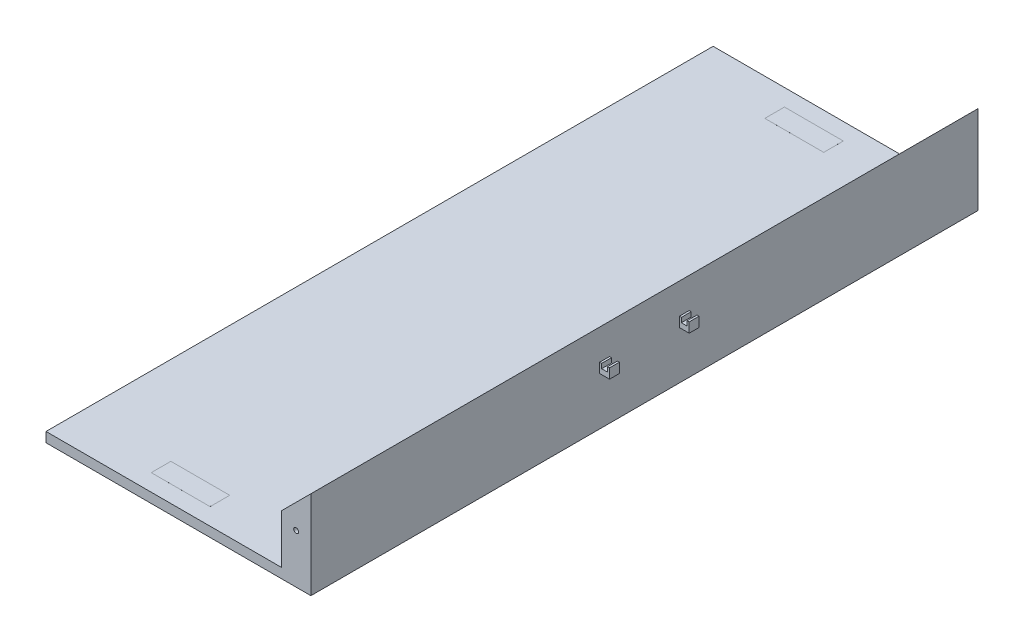
ISO-10303-21;
HEADER;
FILE_DESCRIPTION(('STEP AP214'),'2;1');
FILE_NAME('part.step','',(''),(''),'','','');
FILE_SCHEMA(('AUTOMOTIVE_DESIGN { 1 0 10303 214 1 1 1 1 }'));
ENDSEC;
DATA;
#1=APPLICATION_CONTEXT('core data for automotive mechanical design processes');
#2=APPLICATION_PROTOCOL_DEFINITION('international standard','automotive_design',2000,#1);
#3=PRODUCT_CONTEXT('',#1,'mechanical');
#4=PRODUCT('Part','Part','',(#3));
#5=PRODUCT_RELATED_PRODUCT_CATEGORY('part','',(#4));
#6=PRODUCT_DEFINITION_FORMATION('','',#4);
#7=PRODUCT_DEFINITION_CONTEXT('part definition',#1,'design');
#8=PRODUCT_DEFINITION('design','',#6,#7);
#9=PRODUCT_DEFINITION_SHAPE('','',#8);
#10=(LENGTH_UNIT() NAMED_UNIT(*) SI_UNIT(.MILLI.,.METRE.));
#11=(NAMED_UNIT(*) PLANE_ANGLE_UNIT() SI_UNIT($,.RADIAN.));
#12=(NAMED_UNIT(*) SI_UNIT($,.STERADIAN.) SOLID_ANGLE_UNIT());
#13=UNCERTAINTY_MEASURE_WITH_UNIT(LENGTH_MEASURE(1.E-05),#10,'distance_accuracy_value','');
#14=(GEOMETRIC_REPRESENTATION_CONTEXT(3) GLOBAL_UNCERTAINTY_ASSIGNED_CONTEXT((#13)) GLOBAL_UNIT_ASSIGNED_CONTEXT((#10,
#11,#12)) REPRESENTATION_CONTEXT('',''));
#15=CARTESIAN_POINT('',(0.,0.,0.));
#16=DIRECTION('',(0.,0.,1.));
#17=DIRECTION('',(1.,0.,0.));
#18=AXIS2_PLACEMENT_3D('',#15,#16,#17);
#19=CARTESIAN_POINT('',(50.8,74.8342633823014,489.713888914943));
#20=DIRECTION('',(0.,-1.,0.));
#21=DIRECTION('',(0.,0.,-1.));
#22=AXIS2_PLACEMENT_3D('',#19,#20,#21);
#23=PLANE('',#22);
#24=DIRECTION('',(-1.,0.,0.));
#25=VECTOR('',#24,1.);
#26=CARTESIAN_POINT('',(50.8,74.8342633823014,489.713888914943));
#27=LINE('',#26,#25);
#28=CARTESIAN_POINT('',(40.6685272217805,74.8342633823014,489.713888914943));
#29=VERTEX_POINT('',#28);
#30=CARTESIAN_POINT('',(38.1,74.8342633823014,489.713888914943));
#31=VERTEX_POINT('',#30);
#32=EDGE_CURVE('E382',#29,#31,#27,.T.);
#33=ORIENTED_EDGE('',*,*,#32,.F.);
#34=DIRECTION('',(0.,0.,1.));
#35=VECTOR('',#34,1.);
#36=CARTESIAN_POINT('',(40.6685272217805,74.8342633823014,352.045888914943));
#37=LINE('',#36,#35);
#38=CARTESIAN_POINT('',(40.6685272217805,74.8342633823014,477.013888914943));
#39=VERTEX_POINT('',#38);
#40=EDGE_CURVE('E270',#39,#29,#37,.T.);
#41=ORIENTED_EDGE('',*,*,#40,.F.);
#42=DIRECTION('',(-1.,0.,0.));
#43=VECTOR('',#42,1.);
#44=CARTESIAN_POINT('',(50.8,74.8342633823014,477.013888914943));
#45=LINE('',#44,#43);
#46=CARTESIAN_POINT('',(38.1,74.8342633823014,477.013888914943));
#47=VERTEX_POINT('',#46);
#48=EDGE_CURVE('E385',#39,#47,#45,.T.);
#49=ORIENTED_EDGE('',*,*,#48,.T.);
#50=DIRECTION('',(0.,0.,1.));
#51=VECTOR('',#50,1.);
#52=CARTESIAN_POINT('',(38.1,74.8342633823014,489.713888914943));
#53=LINE('',#52,#51);
#54=EDGE_CURVE('E364',#47,#31,#53,.T.);
#55=ORIENTED_EDGE('',*,*,#54,.T.);
#56=EDGE_LOOP('',(#33,#41,#49,#55));
#57=FACE_BOUND('',#56,.T.);
#58=ADVANCED_FACE('F39',(#57),#23,.F.);
#59=CARTESIAN_POINT('',(50.8,74.8342633823014,373.886111085057));
#60=DIRECTION('',(0.,-1.,0.));
#61=DIRECTION('',(0.,0.,-1.));
#62=AXIS2_PLACEMENT_3D('',#59,#60,#61);
#63=PLANE('',#62);
#64=DIRECTION('',(-1.,0.,0.));
#65=VECTOR('',#64,1.);
#66=CARTESIAN_POINT('',(50.8,74.8342633823014,386.586111085057));
#67=LINE('',#66,#65);
#68=CARTESIAN_POINT('',(40.6685272217805,74.8342633823014,386.586111085057));
#69=VERTEX_POINT('',#68);
#70=CARTESIAN_POINT('',(38.1,74.8342633823014,386.586111085057));
#71=VERTEX_POINT('',#70);
#72=EDGE_CURVE('E335',#69,#71,#67,.T.);
#73=ORIENTED_EDGE('',*,*,#72,.F.);
#74=CARTESIAN_POINT('',(40.6685272217805,74.8342633823014,373.886111085057));
#75=VERTEX_POINT('',#74);
#76=EDGE_CURVE('E269',#75,#69,#37,.T.);
#77=ORIENTED_EDGE('',*,*,#76,.F.);
#78=DIRECTION('',(-1.,0.,0.));
#79=VECTOR('',#78,1.);
#80=CARTESIAN_POINT('',(50.8,74.8342633823014,373.886111085057));
#81=LINE('',#80,#79);
#82=CARTESIAN_POINT('',(38.1,74.8342633823014,373.886111085057));
#83=VERTEX_POINT('',#82);
#84=EDGE_CURVE('E340',#75,#83,#81,.T.);
#85=ORIENTED_EDGE('',*,*,#84,.T.);
#86=DIRECTION('',(0.,0.,1.));
#87=VECTOR('',#86,1.);
#88=CARTESIAN_POINT('',(38.1,74.8342633823014,373.886111085057));
#89=LINE('',#88,#87);
#90=EDGE_CURVE('E317',#83,#71,#89,.T.);
#91=ORIENTED_EDGE('',*,*,#90,.T.);
#92=EDGE_LOOP('',(#73,#77,#85,#91));
#93=FACE_BOUND('',#92,.T.);
#94=ADVANCED_FACE('F603',(#93),#63,.F.);
#95=CARTESIAN_POINT('',(38.1,0.,863.6));
#96=DIRECTION('',(-1.,0.,0.));
#97=DIRECTION('',(0.,0.,1.));
#98=AXIS2_PLACEMENT_3D('',#95,#96,#97);
#99=PLANE('',#98);
#100=DIRECTION('',(0.,1.,0.));
#101=VECTOR('',#100,1.);
#102=CARTESIAN_POINT('',(38.1,74.8342633823014,477.013888914943));
#103=LINE('',#102,#101);
#104=CARTESIAN_POINT('',(38.1,62.1342633823014,477.013888914943));
#105=VERTEX_POINT('',#104);
#106=EDGE_CURVE('E345',#105,#47,#103,.T.);
#107=ORIENTED_EDGE('',*,*,#106,.F.);
#108=DIRECTION('',(0.,0.,-1.));
#109=VECTOR('',#108,1.);
#110=CARTESIAN_POINT('',(38.1,62.1342633823014,489.713888914943));
#111=LINE('',#110,#109);
#112=CARTESIAN_POINT('',(38.1,62.1342633823014,489.713888914943));
#113=VERTEX_POINT('',#112);
#114=EDGE_CURVE('E351',#113,#105,#111,.T.);
#115=ORIENTED_EDGE('',*,*,#114,.F.);
#116=DIRECTION('',(0.,-1.,0.));
#117=VECTOR('',#116,1.);
#118=CARTESIAN_POINT('',(38.1,74.8342633823014,489.713888914943));
#119=LINE('',#118,#117);
#120=EDGE_CURVE('E368',#31,#113,#119,.T.);
#121=ORIENTED_EDGE('',*,*,#120,.F.);
#122=ORIENTED_EDGE('',*,*,#54,.F.);
#123=EDGE_LOOP('',(#107,#115,#121,#122));
#124=FACE_BOUND('',#123,.T.);
#125=DIRECTION('',(0.,1.,0.));
#126=VECTOR('',#125,1.);
#127=CARTESIAN_POINT('',(38.1,0.,0.));
#128=LINE('',#127,#126);
#129=CARTESIAN_POINT('',(38.1,0.,0.));
#130=VERTEX_POINT('',#129);
#131=CARTESIAN_POINT('',(38.1,114.3,0.));
#132=VERTEX_POINT('',#131);
#133=EDGE_CURVE('E528',#130,#132,#128,.T.);
#134=ORIENTED_EDGE('',*,*,#133,.T.);
#135=DIRECTION('',(0.,0.,-1.));
#136=VECTOR('',#135,1.);
#137=CARTESIAN_POINT('',(38.1,114.3,863.6));
#138=LINE('',#137,#136);
#139=CARTESIAN_POINT('',(38.1,114.3,863.6));
#140=VERTEX_POINT('',#139);
#141=EDGE_CURVE('E537',#140,#132,#138,.T.);
#142=ORIENTED_EDGE('',*,*,#141,.F.);
#143=DIRECTION('',(0.,1.,0.));
#144=VECTOR('',#143,1.);
#145=CARTESIAN_POINT('',(38.1,0.,863.6));
#146=LINE('',#145,#144);
#147=CARTESIAN_POINT('',(38.1,0.,863.6));
#148=VERTEX_POINT('',#147);
#149=EDGE_CURVE('E516',#148,#140,#146,.T.);
#150=ORIENTED_EDGE('',*,*,#149,.F.);
#151=DIRECTION('',(0.,0.,-1.));
#152=VECTOR('',#151,1.);
#153=CARTESIAN_POINT('',(38.1,0.,863.6));
#154=LINE('',#153,#152);
#155=EDGE_CURVE('E541',#148,#130,#154,.T.);
#156=ORIENTED_EDGE('',*,*,#155,.T.);
#157=EDGE_LOOP('',(#134,#142,#150,#156));
#158=FACE_BOUND('',#157,.T.);
#159=DIRECTION('',(0.,1.,0.));
#160=VECTOR('',#159,1.);
#161=CARTESIAN_POINT('',(38.1,74.8342633823014,373.886111085057));
#162=LINE('',#161,#160);
#163=CARTESIAN_POINT('',(38.1,62.1342633823014,373.886111085057));
#164=VERTEX_POINT('',#163);
#165=EDGE_CURVE('E298',#164,#83,#162,.T.);
#166=ORIENTED_EDGE('',*,*,#165,.F.);
#167=DIRECTION('',(0.,0.,-1.));
#168=VECTOR('',#167,1.);
#169=CARTESIAN_POINT('',(38.1,62.1342633823014,373.886111085057));
#170=LINE('',#169,#168);
#171=CARTESIAN_POINT('',(38.1,62.1342633823014,386.586111085057));
#172=VERTEX_POINT('',#171);
#173=EDGE_CURVE('E304',#172,#164,#170,.T.);
#174=ORIENTED_EDGE('',*,*,#173,.F.);
#175=DIRECTION('',(0.,-1.,0.));
#176=VECTOR('',#175,1.);
#177=CARTESIAN_POINT('',(38.1,74.8342633823014,386.586111085057));
#178=LINE('',#177,#176);
#179=EDGE_CURVE('E321',#71,#172,#178,.T.);
#180=ORIENTED_EDGE('',*,*,#179,.F.);
#181=ORIENTED_EDGE('',*,*,#90,.F.);
#182=EDGE_LOOP('',(#166,#174,#180,#181));
#183=FACE_BOUND('',#182,.T.);
#184=ADVANCED_FACE('F578',(#124,#158,#183),#99,.F.);
#185=CARTESIAN_POINT('',(0.,12.7,863.6));
#186=DIRECTION('',(0.,1.,0.));
#187=DIRECTION('',(-1.,0.,0.));
#188=AXIS2_PLACEMENT_3D('',#185,#186,#187);
#189=PLANE('',#188);
#190=DIRECTION('',(1.,0.,0.));
#191=VECTOR('',#190,1.);
#192=CARTESIAN_POINT('',(0.,12.7,0.));
#193=LINE('',#192,#191);
#194=CARTESIAN_POINT('',(-304.8,12.7,0.));
#195=VERTEX_POINT('',#194);
#196=CARTESIAN_POINT('',(0.,12.7,0.));
#197=VERTEX_POINT('',#196);
#198=EDGE_CURVE('E478',#195,#197,#193,.T.);
#199=ORIENTED_EDGE('',*,*,#198,.F.);
#200=DIRECTION('',(0.,0.,-1.));
#201=VECTOR('',#200,1.);
#202=CARTESIAN_POINT('',(-304.8,12.7,863.6));
#203=LINE('',#202,#201);
#204=CARTESIAN_POINT('',(-304.8,12.7,863.6));
#205=VERTEX_POINT('',#204);
#206=EDGE_CURVE('E494',#205,#195,#203,.T.);
#207=ORIENTED_EDGE('',*,*,#206,.F.);
#208=DIRECTION('',(1.,0.,0.));
#209=VECTOR('',#208,1.);
#210=CARTESIAN_POINT('',(0.,12.7,863.6));
#211=LINE('',#210,#209);
#212=CARTESIAN_POINT('',(0.,12.7,863.6));
#213=VERTEX_POINT('',#212);
#214=EDGE_CURVE('E477',#205,#213,#211,.T.);
#215=ORIENTED_EDGE('',*,*,#214,.T.);
#216=DIRECTION('',(0.,0.,-1.));
#217=VECTOR('',#216,1.);
#218=CARTESIAN_POINT('',(0.,12.7,863.6));
#219=LINE('',#218,#217);
#220=EDGE_CURVE('E489',#213,#197,#219,.T.);
#221=ORIENTED_EDGE('',*,*,#220,.T.);
#222=EDGE_LOOP('',(#199,#207,#215,#221));
#223=FACE_BOUND('',#222,.T.);
#224=DIRECTION('',(-1.,0.,0.));
#225=VECTOR('',#224,1.);
#226=CARTESIAN_POINT('',(-190.5,12.7,21.9367588671617));
#227=LINE('',#226,#225);
#228=CARTESIAN_POINT('',(-114.3,12.7,21.9367588671617));
#229=VERTEX_POINT('',#228);
#230=CARTESIAN_POINT('',(-190.5,12.7,21.9367588671617));
#231=VERTEX_POINT('',#230);
#232=EDGE_CURVE('E450',#229,#231,#227,.T.);
#233=ORIENTED_EDGE('',*,*,#232,.F.);
#234=DIRECTION('',(0.,0.,-1.));
#235=VECTOR('',#234,1.);
#236=CARTESIAN_POINT('',(-114.3,12.7,21.9367588671617));
#237=LINE('',#236,#235);
#238=CARTESIAN_POINT('',(-114.3,12.7,47.3367588671617));
#239=VERTEX_POINT('',#238);
#240=EDGE_CURVE('E431',#239,#229,#237,.T.);
#241=ORIENTED_EDGE('',*,*,#240,.F.);
#242=DIRECTION('',(1.,0.,0.));
#243=VECTOR('',#242,1.);
#244=CARTESIAN_POINT('',(-190.5,12.7,47.3367588671617));
#245=LINE('',#244,#243);
#246=CARTESIAN_POINT('',(-190.5,12.7,47.3367588671617));
#247=VERTEX_POINT('',#246);
#248=EDGE_CURVE('E437',#247,#239,#245,.T.);
#249=ORIENTED_EDGE('',*,*,#248,.F.);
#250=DIRECTION('',(0.,0.,1.));
#251=VECTOR('',#250,1.);
#252=CARTESIAN_POINT('',(-190.5,12.7,21.9367588671617));
#253=LINE('',#252,#251);
#254=EDGE_CURVE('E453',#231,#247,#253,.T.);
#255=ORIENTED_EDGE('',*,*,#254,.F.);
#256=EDGE_LOOP('',(#233,#241,#249,#255));
#257=FACE_BOUND('',#256,.T.);
#258=DIRECTION('',(0.,0.,-1.));
#259=VECTOR('',#258,1.);
#260=CARTESIAN_POINT('',(-114.3,12.7,841.663241132838));
#261=LINE('',#260,#259);
#262=CARTESIAN_POINT('',(-114.3,12.7,841.663241132838));
#263=VERTEX_POINT('',#262);
#264=CARTESIAN_POINT('',(-114.3,12.7,816.263241132838));
#265=VERTEX_POINT('',#264);
#266=EDGE_CURVE('E409',#263,#265,#261,.T.);
#267=ORIENTED_EDGE('',*,*,#266,.F.);
#268=DIRECTION('',(1.,0.,0.));
#269=VECTOR('',#268,1.);
#270=CARTESIAN_POINT('',(-190.5,12.7,841.663241132838));
#271=LINE('',#270,#269);
#272=CARTESIAN_POINT('',(-190.5,12.7,841.663241132838));
#273=VERTEX_POINT('',#272);
#274=EDGE_CURVE('E390',#273,#263,#271,.T.);
#275=ORIENTED_EDGE('',*,*,#274,.F.);
#276=DIRECTION('',(0.,0.,1.));
#277=VECTOR('',#276,1.);
#278=CARTESIAN_POINT('',(-190.5,12.7,841.663241132838));
#279=LINE('',#278,#277);
#280=CARTESIAN_POINT('',(-190.5,12.7,816.263241132838));
#281=VERTEX_POINT('',#280);
#282=EDGE_CURVE('E396',#281,#273,#279,.T.);
#283=ORIENTED_EDGE('',*,*,#282,.F.);
#284=DIRECTION('',(-1.,0.,0.));
#285=VECTOR('',#284,1.);
#286=CARTESIAN_POINT('',(-190.5,12.7,816.263241132838));
#287=LINE('',#286,#285);
#288=EDGE_CURVE('E412',#265,#281,#287,.T.);
#289=ORIENTED_EDGE('',*,*,#288,.F.);
#290=EDGE_LOOP('',(#267,#275,#283,#289));
#291=FACE_BOUND('',#290,.T.);
#292=ADVANCED_FACE('F661',(#223,#257,#291),#189,.T.);
#293=CARTESIAN_POINT('',(0.,0.,863.6));
#294=DIRECTION('',(1.,0.,0.));
#295=DIRECTION('',(0.,0.,-1.));
#296=AXIS2_PLACEMENT_3D('',#293,#294,#295);
#297=PLANE('',#296);
#298=ORIENTED_EDGE('',*,*,#220,.F.);
#299=DIRECTION('',(0.,-1.,0.));
#300=VECTOR('',#299,1.);
#301=CARTESIAN_POINT('',(0.,0.,863.6));
#302=LINE('',#301,#300);
#303=CARTESIAN_POINT('',(0.,76.2,863.6));
#304=VERTEX_POINT('',#303);
#305=EDGE_CURVE('E508',#304,#213,#302,.T.);
#306=ORIENTED_EDGE('',*,*,#305,.F.);
#307=DIRECTION('',(0.,0.,-1.));
#308=VECTOR('',#307,1.);
#309=CARTESIAN_POINT('',(0.,76.2,863.6));
#310=LINE('',#309,#308);
#311=CARTESIAN_POINT('',(0.,76.2,0.));
#312=VERTEX_POINT('',#311);
#313=EDGE_CURVE('E522',#304,#312,#310,.T.);
#314=ORIENTED_EDGE('',*,*,#313,.T.);
#315=DIRECTION('',(0.,-1.,0.));
#316=VECTOR('',#315,1.);
#317=CARTESIAN_POINT('',(0.,0.,0.));
#318=LINE('',#317,#316);
#319=EDGE_CURVE('E504',#312,#197,#318,.T.);
#320=ORIENTED_EDGE('',*,*,#319,.T.);
#321=EDGE_LOOP('',(#298,#306,#314,#320));
#322=FACE_BOUND('',#321,.T.);
#323=ADVANCED_FACE('F41',(#322),#297,.F.);
#324=CARTESIAN_POINT('',(0.,0.,863.6));
#325=DIRECTION('',(0.,1.,0.));
#326=DIRECTION('',(0.,0.,1.));
#327=AXIS2_PLACEMENT_3D('',#324,#325,#326);
#328=PLANE('',#327);
#329=DIRECTION('',(1.,0.,0.));
#330=VECTOR('',#329,1.);
#331=CARTESIAN_POINT('',(0.,0.,0.));
#332=LINE('',#331,#330);
#333=CARTESIAN_POINT('',(-304.8,0.,0.));
#334=VERTEX_POINT('',#333);
#335=EDGE_CURVE('E525',#334,#130,#332,.T.);
#336=ORIENTED_EDGE('',*,*,#335,.T.);
#337=ORIENTED_EDGE('',*,*,#155,.F.);
#338=DIRECTION('',(1.,0.,0.));
#339=VECTOR('',#338,1.);
#340=CARTESIAN_POINT('',(0.,0.,863.6));
#341=LINE('',#340,#339);
#342=CARTESIAN_POINT('',(-304.8,0.,863.6));
#343=VERTEX_POINT('',#342);
#344=EDGE_CURVE('E512',#343,#148,#341,.T.);
#345=ORIENTED_EDGE('',*,*,#344,.F.);
#346=DIRECTION('',(0.,0.,-1.));
#347=VECTOR('',#346,1.);
#348=CARTESIAN_POINT('',(-304.8,0.,863.6));
#349=LINE('',#348,#347);
#350=EDGE_CURVE('E482',#343,#334,#349,.T.);
#351=ORIENTED_EDGE('',*,*,#350,.T.);
#352=EDGE_LOOP('',(#336,#337,#345,#351));
#353=FACE_BOUND('',#352,.T.);
#354=ADVANCED_FACE('F683',(#353),#328,.F.);
#355=CARTESIAN_POINT('',(0.,76.2,863.6));
#356=DIRECTION('',(0.707106781186546,-0.707106781186549,0.));
#357=DIRECTION('',(0.707106781186549,0.707106781186546,0.));
#358=AXIS2_PLACEMENT_3D('',#355,#356,#357);
#359=PLANE('',#358);
#360=DIRECTION('',(-0.707106781186549,-0.707106781186546,0.));
#361=VECTOR('',#360,1.);
#362=CARTESIAN_POINT('',(0.,76.2,0.));
#363=LINE('',#362,#361);
#364=EDGE_CURVE('E513',#132,#312,#363,.T.);
#365=ORIENTED_EDGE('',*,*,#364,.T.);
#366=ORIENTED_EDGE('',*,*,#313,.F.);
#367=DIRECTION('',(-0.707106781186546,-0.707106781186548,0.));
#368=VECTOR('',#367,1.);
#369=CARTESIAN_POINT('',(19.7160815558735,95.9160815558735,863.6));
#370=LINE('',#369,#368);
#371=EDGE_CURVE('E519',#140,#304,#370,.T.);
#372=ORIENTED_EDGE('',*,*,#371,.F.);
#373=ORIENTED_EDGE('',*,*,#141,.T.);
#374=EDGE_LOOP('',(#365,#366,#372,#373));
#375=FACE_BOUND('',#374,.T.);
#376=ADVANCED_FACE('F676',(#375),#359,.F.);
#377=CARTESIAN_POINT('',(0.,0.,863.6));
#378=DIRECTION('',(0.,0.,-1.));
#379=DIRECTION('',(-1.,0.,0.));
#380=AXIS2_PLACEMENT_3D('',#377,#378,#379);
#381=PLANE('',#380);
#382=CARTESIAN_POINT('',(19.05,63.5,863.6));
#383=DIRECTION('',(0.,0.,1.));
#384=DIRECTION('',(1.,0.,0.));
#385=AXIS2_PLACEMENT_3D('',#382,#383,#384);
#386=CIRCLE('',#385,3.175);
#387=CARTESIAN_POINT('',(22.225,63.5,863.6));
#388=VERTEX_POINT('',#387);
#389=EDGE_CURVE('E493',#388,#388,#386,.T.);
#390=ORIENTED_EDGE('',*,*,#389,.F.);
#391=EDGE_LOOP('',(#390));
#392=FACE_BOUND('',#391,.T.);
#393=ORIENTED_EDGE('',*,*,#305,.T.);
#394=ORIENTED_EDGE('',*,*,#214,.F.);
#395=DIRECTION('',(0.,1.,0.));
#396=VECTOR('',#395,1.);
#397=CARTESIAN_POINT('',(-304.8,12.7,863.6));
#398=LINE('',#397,#396);
#399=EDGE_CURVE('E473',#343,#205,#398,.T.);
#400=ORIENTED_EDGE('',*,*,#399,.F.);
#401=ORIENTED_EDGE('',*,*,#344,.T.);
#402=ORIENTED_EDGE('',*,*,#149,.T.);
#403=ORIENTED_EDGE('',*,*,#371,.T.);
#404=EDGE_LOOP('',(#393,#394,#400,#401,#402,#403));
#405=FACE_BOUND('',#404,.T.);
#406=ADVANCED_FACE('F673',(#392,#405),#381,.F.);
#407=CARTESIAN_POINT('',(0.,0.,0.));
#408=DIRECTION('',(0.,0.,-1.));
#409=DIRECTION('',(-1.,0.,0.));
#410=AXIS2_PLACEMENT_3D('',#407,#408,#409);
#411=PLANE('',#410);
#412=CARTESIAN_POINT('',(19.05,63.5,0.));
#413=DIRECTION('',(0.,0.,1.));
#414=DIRECTION('',(1.,0.,0.));
#415=AXIS2_PLACEMENT_3D('',#412,#413,#414);
#416=CIRCLE('',#415,3.175);
#417=CARTESIAN_POINT('',(22.225,63.5,0.));
#418=VERTEX_POINT('',#417);
#419=EDGE_CURVE('E500',#418,#418,#416,.T.);
#420=ORIENTED_EDGE('',*,*,#419,.T.);
#421=EDGE_LOOP('',(#420));
#422=FACE_BOUND('',#421,.T.);
#423=ORIENTED_EDGE('',*,*,#319,.F.);
#424=ORIENTED_EDGE('',*,*,#364,.F.);
#425=ORIENTED_EDGE('',*,*,#133,.F.);
#426=ORIENTED_EDGE('',*,*,#335,.F.);
#427=DIRECTION('',(0.,1.,0.));
#428=VECTOR('',#427,1.);
#429=CARTESIAN_POINT('',(-304.8,12.7,0.));
#430=LINE('',#429,#428);
#431=EDGE_CURVE('E472',#334,#195,#430,.T.);
#432=ORIENTED_EDGE('',*,*,#431,.T.);
#433=ORIENTED_EDGE('',*,*,#198,.T.);
#434=EDGE_LOOP('',(#423,#424,#425,#426,#432,#433));
#435=FACE_BOUND('',#434,.T.);
#436=ADVANCED_FACE('F671',(#422,#435),#411,.T.);
#437=CARTESIAN_POINT('',(19.05,63.5,0.));
#438=DIRECTION('',(0.,0.,1.));
#439=DIRECTION('',(1.,0.,0.));
#440=AXIS2_PLACEMENT_3D('',#437,#438,#439);
#441=CYLINDRICAL_SURFACE('',#440,3.175);
#442=ORIENTED_EDGE('',*,*,#419,.F.);
#443=EDGE_LOOP('',(#442));
#444=FACE_BOUND('',#443,.T.);
#445=ORIENTED_EDGE('',*,*,#389,.T.);
#446=EDGE_LOOP('',(#445));
#447=FACE_BOUND('',#446,.T.);
#448=ADVANCED_FACE('F667',(#444,#447),#441,.F.);
#449=CARTESIAN_POINT('',(-304.8,12.7,863.6));
#450=DIRECTION('',(-1.,0.,0.));
#451=DIRECTION('',(0.,0.,1.));
#452=AXIS2_PLACEMENT_3D('',#449,#450,#451);
#453=PLANE('',#452);
#454=ORIENTED_EDGE('',*,*,#431,.F.);
#455=ORIENTED_EDGE('',*,*,#350,.F.);
#456=ORIENTED_EDGE('',*,*,#399,.T.);
#457=ORIENTED_EDGE('',*,*,#206,.T.);
#458=EDGE_LOOP('',(#454,#455,#456,#457));
#459=FACE_BOUND('',#458,.T.);
#460=ADVANCED_FACE('F659',(#459),#453,.T.);
#461=CARTESIAN_POINT('',(-114.3,12.7127,21.9367588671617));
#462=DIRECTION('',(-1.,0.,0.));
#463=DIRECTION('',(0.,0.,1.));
#464=AXIS2_PLACEMENT_3D('',#461,#462,#463);
#465=PLANE('',#464);
#466=ORIENTED_EDGE('',*,*,#240,.T.);
#467=DIRECTION('',(0.,-1.,0.));
#468=VECTOR('',#467,1.);
#469=CARTESIAN_POINT('',(-114.3,12.7127,21.9367588671617));
#470=LINE('',#469,#468);
#471=CARTESIAN_POINT('',(-114.3,12.7127,21.9367588671617));
#472=VERTEX_POINT('',#471);
#473=EDGE_CURVE('E469',#472,#229,#470,.T.);
#474=ORIENTED_EDGE('',*,*,#473,.F.);
#475=DIRECTION('',(0.,0.,-1.));
#476=VECTOR('',#475,1.);
#477=CARTESIAN_POINT('',(-114.3,12.7127,21.9367588671617));
#478=LINE('',#477,#476);
#479=CARTESIAN_POINT('',(-114.3,12.7127,47.3367588671617));
#480=VERTEX_POINT('',#479);
#481=EDGE_CURVE('E432',#480,#472,#478,.T.);
#482=ORIENTED_EDGE('',*,*,#481,.F.);
#483=DIRECTION('',(0.,-1.,0.));
#484=VECTOR('',#483,1.);
#485=CARTESIAN_POINT('',(-114.3,12.7127,47.3367588671617));
#486=LINE('',#485,#484);
#487=EDGE_CURVE('E446',#480,#239,#486,.T.);
#488=ORIENTED_EDGE('',*,*,#487,.T.);
#489=EDGE_LOOP('',(#466,#474,#482,#488));
#490=FACE_BOUND('',#489,.T.);
#491=ADVANCED_FACE('F655',(#490),#465,.F.);
#492=CARTESIAN_POINT('',(-190.5,12.7127,21.9367588671617));
#493=DIRECTION('',(0.,0.,1.));
#494=DIRECTION('',(1.,0.,0.));
#495=AXIS2_PLACEMENT_3D('',#492,#493,#494);
#496=PLANE('',#495);
#497=ORIENTED_EDGE('',*,*,#232,.T.);
#498=DIRECTION('',(0.,-1.,0.));
#499=VECTOR('',#498,1.);
#500=CARTESIAN_POINT('',(-190.5,12.7127,21.9367588671617));
#501=LINE('',#500,#499);
#502=CARTESIAN_POINT('',(-190.5,12.7127,21.9367588671617));
#503=VERTEX_POINT('',#502);
#504=EDGE_CURVE('E465',#503,#231,#501,.T.);
#505=ORIENTED_EDGE('',*,*,#504,.F.);
#506=DIRECTION('',(-1.,0.,0.));
#507=VECTOR('',#506,1.);
#508=CARTESIAN_POINT('',(-190.5,12.7127,21.9367588671617));
#509=LINE('',#508,#507);
#510=EDGE_CURVE('E436',#472,#503,#509,.T.);
#511=ORIENTED_EDGE('',*,*,#510,.F.);
#512=ORIENTED_EDGE('',*,*,#473,.T.);
#513=EDGE_LOOP('',(#497,#505,#511,#512));
#514=FACE_BOUND('',#513,.T.);
#515=ADVANCED_FACE('F651',(#514),#496,.F.);
#516=CARTESIAN_POINT('',(-190.5,12.7127,21.9367588671617));
#517=DIRECTION('',(1.,0.,0.));
#518=DIRECTION('',(0.,1.,0.));
#519=AXIS2_PLACEMENT_3D('',#516,#517,#518);
#520=PLANE('',#519);
#521=ORIENTED_EDGE('',*,*,#254,.T.);
#522=DIRECTION('',(0.,-1.,0.));
#523=VECTOR('',#522,1.);
#524=CARTESIAN_POINT('',(-190.5,12.7127,47.3367588671617));
#525=LINE('',#524,#523);
#526=CARTESIAN_POINT('',(-190.5,12.7127,47.3367588671617));
#527=VERTEX_POINT('',#526);
#528=EDGE_CURVE('E462',#527,#247,#525,.T.);
#529=ORIENTED_EDGE('',*,*,#528,.F.);
#530=DIRECTION('',(0.,0.,1.));
#531=VECTOR('',#530,1.);
#532=CARTESIAN_POINT('',(-190.5,12.7127,21.9367588671617));
#533=LINE('',#532,#531);
#534=EDGE_CURVE('E440',#503,#527,#533,.T.);
#535=ORIENTED_EDGE('',*,*,#534,.F.);
#536=ORIENTED_EDGE('',*,*,#504,.T.);
#537=EDGE_LOOP('',(#521,#529,#535,#536));
#538=FACE_BOUND('',#537,.T.);
#539=ADVANCED_FACE('F647',(#538),#520,.F.);
#540=CARTESIAN_POINT('',(-190.5,12.7127,47.3367588671617));
#541=DIRECTION('',(0.,0.,-1.));
#542=DIRECTION('',(-1.,0.,0.));
#543=AXIS2_PLACEMENT_3D('',#540,#541,#542);
#544=PLANE('',#543);
#545=ORIENTED_EDGE('',*,*,#248,.T.);
#546=ORIENTED_EDGE('',*,*,#487,.F.);
#547=DIRECTION('',(1.,0.,0.));
#548=VECTOR('',#547,1.);
#549=CARTESIAN_POINT('',(-190.5,12.7127,47.3367588671617));
#550=LINE('',#549,#548);
#551=EDGE_CURVE('E443',#527,#480,#550,.T.);
#552=ORIENTED_EDGE('',*,*,#551,.F.);
#553=ORIENTED_EDGE('',*,*,#528,.T.);
#554=EDGE_LOOP('',(#545,#546,#552,#553));
#555=FACE_BOUND('',#554,.T.);
#556=ADVANCED_FACE('F643',(#555),#544,.F.);
#557=CARTESIAN_POINT('',(0.,12.7127,0.));
#558=DIRECTION('',(0.,1.,0.));
#559=DIRECTION('',(0.,0.,1.));
#560=AXIS2_PLACEMENT_3D('',#557,#558,#559);
#561=PLANE('',#560);
#562=ORIENTED_EDGE('',*,*,#481,.T.);
#563=ORIENTED_EDGE('',*,*,#510,.T.);
#564=ORIENTED_EDGE('',*,*,#534,.T.);
#565=ORIENTED_EDGE('',*,*,#551,.T.);
#566=EDGE_LOOP('',(#562,#563,#564,#565));
#567=FACE_BOUND('',#566,.T.);
#568=ADVANCED_FACE('F639',(#567),#561,.T.);
#569=CARTESIAN_POINT('',(-190.5,12.7127,841.663241132838));
#570=DIRECTION('',(0.,0.,-1.));
#571=DIRECTION('',(-1.,0.,0.));
#572=AXIS2_PLACEMENT_3D('',#569,#570,#571);
#573=PLANE('',#572);
#574=ORIENTED_EDGE('',*,*,#274,.T.);
#575=DIRECTION('',(0.,-1.,0.));
#576=VECTOR('',#575,1.);
#577=CARTESIAN_POINT('',(-114.3,12.7127,841.663241132838));
#578=LINE('',#577,#576);
#579=CARTESIAN_POINT('',(-114.3,12.7127,841.663241132838));
#580=VERTEX_POINT('',#579);
#581=EDGE_CURVE('E428',#580,#263,#578,.T.);
#582=ORIENTED_EDGE('',*,*,#581,.F.);
#583=DIRECTION('',(1.,0.,0.));
#584=VECTOR('',#583,1.);
#585=CARTESIAN_POINT('',(-190.5,12.7127,841.663241132838));
#586=LINE('',#585,#584);
#587=CARTESIAN_POINT('',(-190.5,12.7127,841.663241132838));
#588=VERTEX_POINT('',#587);
#589=EDGE_CURVE('E391',#588,#580,#586,.T.);
#590=ORIENTED_EDGE('',*,*,#589,.F.);
#591=DIRECTION('',(0.,-1.,0.));
#592=VECTOR('',#591,1.);
#593=CARTESIAN_POINT('',(-190.5,12.7127,841.663241132838));
#594=LINE('',#593,#592);
#595=EDGE_CURVE('E405',#588,#273,#594,.T.);
#596=ORIENTED_EDGE('',*,*,#595,.T.);
#597=EDGE_LOOP('',(#574,#582,#590,#596));
#598=FACE_BOUND('',#597,.T.);
#599=ADVANCED_FACE('F635',(#598),#573,.F.);
#600=CARTESIAN_POINT('',(-114.3,12.7127,841.663241132838));
#601=DIRECTION('',(-1.,0.,0.));
#602=DIRECTION('',(0.,0.,1.));
#603=AXIS2_PLACEMENT_3D('',#600,#601,#602);
#604=PLANE('',#603);
#605=ORIENTED_EDGE('',*,*,#266,.T.);
#606=DIRECTION('',(0.,-1.,0.));
#607=VECTOR('',#606,1.);
#608=CARTESIAN_POINT('',(-114.3,12.7127,816.263241132838));
#609=LINE('',#608,#607);
#610=CARTESIAN_POINT('',(-114.3,12.7127,816.263241132838));
#611=VERTEX_POINT('',#610);
#612=EDGE_CURVE('E424',#611,#265,#609,.T.);
#613=ORIENTED_EDGE('',*,*,#612,.F.);
#614=DIRECTION('',(0.,0.,-1.));
#615=VECTOR('',#614,1.);
#616=CARTESIAN_POINT('',(-114.3,12.7127,841.663241132838));
#617=LINE('',#616,#615);
#618=EDGE_CURVE('E395',#580,#611,#617,.T.);
#619=ORIENTED_EDGE('',*,*,#618,.F.);
#620=ORIENTED_EDGE('',*,*,#581,.T.);
#621=EDGE_LOOP('',(#605,#613,#619,#620));
#622=FACE_BOUND('',#621,.T.);
#623=ADVANCED_FACE('F631',(#622),#604,.F.);
#624=CARTESIAN_POINT('',(-190.5,12.7127,816.263241132838));
#625=DIRECTION('',(0.,0.,1.));
#626=DIRECTION('',(1.,0.,0.));
#627=AXIS2_PLACEMENT_3D('',#624,#625,#626);
#628=PLANE('',#627);
#629=ORIENTED_EDGE('',*,*,#288,.T.);
#630=DIRECTION('',(0.,-1.,0.));
#631=VECTOR('',#630,1.);
#632=CARTESIAN_POINT('',(-190.5,12.7127,816.263241132838));
#633=LINE('',#632,#631);
#634=CARTESIAN_POINT('',(-190.5,12.7127,816.263241132838));
#635=VERTEX_POINT('',#634);
#636=EDGE_CURVE('E421',#635,#281,#633,.T.);
#637=ORIENTED_EDGE('',*,*,#636,.F.);
#638=DIRECTION('',(-1.,0.,0.));
#639=VECTOR('',#638,1.);
#640=CARTESIAN_POINT('',(-190.5,12.7127,816.263241132838));
#641=LINE('',#640,#639);
#642=EDGE_CURVE('E399',#611,#635,#641,.T.);
#643=ORIENTED_EDGE('',*,*,#642,.F.);
#644=ORIENTED_EDGE('',*,*,#612,.T.);
#645=EDGE_LOOP('',(#629,#637,#643,#644));
#646=FACE_BOUND('',#645,.T.);
#647=ADVANCED_FACE('F627',(#646),#628,.F.);
#648=CARTESIAN_POINT('',(-190.5,12.7127,841.663241132838));
#649=DIRECTION('',(1.,0.,0.));
#650=DIRECTION('',(0.,1.,0.));
#651=AXIS2_PLACEMENT_3D('',#648,#649,#650);
#652=PLANE('',#651);
#653=ORIENTED_EDGE('',*,*,#282,.T.);
#654=ORIENTED_EDGE('',*,*,#595,.F.);
#655=DIRECTION('',(0.,0.,1.));
#656=VECTOR('',#655,1.);
#657=CARTESIAN_POINT('',(-190.5,12.7127,841.663241132838));
#658=LINE('',#657,#656);
#659=EDGE_CURVE('E402',#635,#588,#658,.T.);
#660=ORIENTED_EDGE('',*,*,#659,.F.);
#661=ORIENTED_EDGE('',*,*,#636,.T.);
#662=EDGE_LOOP('',(#653,#654,#660,#661));
#663=FACE_BOUND('',#662,.T.);
#664=ADVANCED_FACE('F621',(#663),#652,.F.);
#665=CARTESIAN_POINT('',(0.,12.7127,0.));
#666=DIRECTION('',(0.,1.,0.));
#667=DIRECTION('',(0.,0.,1.));
#668=AXIS2_PLACEMENT_3D('',#665,#666,#667);
#669=PLANE('',#668);
#670=ORIENTED_EDGE('',*,*,#589,.T.);
#671=ORIENTED_EDGE('',*,*,#618,.T.);
#672=ORIENTED_EDGE('',*,*,#642,.T.);
#673=ORIENTED_EDGE('',*,*,#659,.T.);
#674=EDGE_LOOP('',(#670,#671,#672,#673));
#675=FACE_BOUND('',#674,.T.);
#676=ADVANCED_FACE('F617',(#675),#669,.T.);
#677=CARTESIAN_POINT('',(50.8,74.8342633823014,477.013888914943));
#678=DIRECTION('',(0.,0.,1.));
#679=DIRECTION('',(1.,0.,0.));
#680=AXIS2_PLACEMENT_3D('',#677,#678,#679);
#681=PLANE('',#680);
#682=ORIENTED_EDGE('',*,*,#48,.F.);
#683=DIRECTION('',(0.,-1.,0.));
#684=VECTOR('',#683,1.);
#685=CARTESIAN_POINT('',(40.6685272217805,74.8342633823014,477.013888914943));
#686=LINE('',#685,#684);
#687=CARTESIAN_POINT('',(40.6685272217805,68.8120700360058,477.013888914943));
#688=VERTEX_POINT('',#687);
#689=EDGE_CURVE('E294',#39,#688,#686,.T.);
#690=ORIENTED_EDGE('',*,*,#689,.T.);
#691=DIRECTION('',(1.,0.,0.));
#692=VECTOR('',#691,1.);
#693=CARTESIAN_POINT('',(50.8,68.8120700360058,477.013888914943));
#694=LINE('',#693,#692);
#695=CARTESIAN_POINT('',(48.2224711952195,68.8120700360058,477.013888914943));
#696=VERTEX_POINT('',#695);
#697=EDGE_CURVE('E281',#688,#696,#694,.T.);
#698=ORIENTED_EDGE('',*,*,#697,.T.);
#699=DIRECTION('',(0.,1.,0.));
#700=VECTOR('',#699,1.);
#701=CARTESIAN_POINT('',(48.2224711952195,74.8342633823014,477.013888914943));
#702=LINE('',#701,#700);
#703=CARTESIAN_POINT('',(48.2224711952195,74.8342633823014,477.013888914943));
#704=VERTEX_POINT('',#703);
#705=EDGE_CURVE('E244',#696,#704,#702,.T.);
#706=ORIENTED_EDGE('',*,*,#705,.T.);
#707=CARTESIAN_POINT('',(50.8,74.8342633823014,477.013888914943));
#708=VERTEX_POINT('',#707);
#709=EDGE_CURVE('E386',#708,#704,#45,.T.);
#710=ORIENTED_EDGE('',*,*,#709,.F.);
#711=DIRECTION('',(0.,1.,0.));
#712=VECTOR('',#711,1.);
#713=CARTESIAN_POINT('',(50.8,74.8342633823014,477.013888914943));
#714=LINE('',#713,#712);
#715=CARTESIAN_POINT('',(50.8,62.1342633823014,477.013888914943));
#716=VERTEX_POINT('',#715);
#717=EDGE_CURVE('E346',#716,#708,#714,.T.);
#718=ORIENTED_EDGE('',*,*,#717,.F.);
#719=DIRECTION('',(-1.,0.,0.));
#720=VECTOR('',#719,1.);
#721=CARTESIAN_POINT('',(50.8,62.1342633823014,477.013888914943));
#722=LINE('',#721,#720);
#723=EDGE_CURVE('E360',#716,#105,#722,.T.);
#724=ORIENTED_EDGE('',*,*,#723,.T.);
#725=ORIENTED_EDGE('',*,*,#106,.T.);
#726=EDGE_LOOP('',(#682,#690,#698,#706,#710,#718,#724,#725));
#727=FACE_BOUND('',#726,.T.);
#728=ADVANCED_FACE('F580',(#727),#681,.F.);
#729=ORIENTED_EDGE('',*,*,#709,.T.);
#730=DIRECTION('',(0.,0.,1.));
#731=VECTOR('',#730,1.);
#732=CARTESIAN_POINT('',(48.2224711952195,74.8342633823014,352.045888914943));
#733=LINE('',#732,#731);
#734=CARTESIAN_POINT('',(48.2224711952195,74.8342633823014,489.713888914943));
#735=VERTEX_POINT('',#734);
#736=EDGE_CURVE('E274',#704,#735,#733,.T.);
#737=ORIENTED_EDGE('',*,*,#736,.T.);
#738=CARTESIAN_POINT('',(50.8,74.8342633823014,489.713888914943));
#739=VERTEX_POINT('',#738);
#740=EDGE_CURVE('E261',#739,#735,#27,.T.);
#741=ORIENTED_EDGE('',*,*,#740,.F.);
#742=DIRECTION('',(0.,0.,1.));
#743=VECTOR('',#742,1.);
#744=CARTESIAN_POINT('',(50.8,74.8342633823014,489.713888914943));
#745=LINE('',#744,#743);
#746=EDGE_CURVE('E350',#708,#739,#745,.T.);
#747=ORIENTED_EDGE('',*,*,#746,.F.);
#748=EDGE_LOOP('',(#729,#737,#741,#747));
#749=FACE_BOUND('',#748,.T.);
#750=ADVANCED_FACE('F591',(#749),#23,.F.);
#751=CARTESIAN_POINT('',(50.8,74.8342633823014,489.713888914943));
#752=DIRECTION('',(0.,0.,-1.));
#753=DIRECTION('',(-1.,0.,0.));
#754=AXIS2_PLACEMENT_3D('',#751,#752,#753);
#755=PLANE('',#754);
#756=DIRECTION('',(1.,0.,0.));
#757=VECTOR('',#756,1.);
#758=CARTESIAN_POINT('',(44.45,68.8120700360058,489.713888914943));
#759=LINE('',#758,#757);
#760=CARTESIAN_POINT('',(40.6685272217805,68.8120700360058,489.713888914943));
#761=VERTEX_POINT('',#760);
#762=CARTESIAN_POINT('',(48.2224711952195,68.8120700360058,489.713888914943));
#763=VERTEX_POINT('',#762);
#764=EDGE_CURVE('E251',#761,#763,#759,.T.);
#765=ORIENTED_EDGE('',*,*,#764,.F.);
#766=DIRECTION('',(0.,-1.,0.));
#767=VECTOR('',#766,1.);
#768=CARTESIAN_POINT('',(40.6685272217805,74.8342633823014,489.713888914943));
#769=LINE('',#768,#767);
#770=EDGE_CURVE('E55',#29,#761,#769,.T.);
#771=ORIENTED_EDGE('',*,*,#770,.F.);
#772=ORIENTED_EDGE('',*,*,#32,.T.);
#773=ORIENTED_EDGE('',*,*,#120,.T.);
#774=DIRECTION('',(-1.,0.,0.));
#775=VECTOR('',#774,1.);
#776=CARTESIAN_POINT('',(50.8,62.1342633823014,489.713888914943));
#777=LINE('',#776,#775);
#778=CARTESIAN_POINT('',(50.8,62.1342633823014,489.713888914943));
#779=VERTEX_POINT('',#778);
#780=EDGE_CURVE('E378',#779,#113,#777,.T.);
#781=ORIENTED_EDGE('',*,*,#780,.F.);
#782=DIRECTION('',(0.,-1.,0.));
#783=VECTOR('',#782,1.);
#784=CARTESIAN_POINT('',(50.8,74.8342633823014,489.713888914943));
#785=LINE('',#784,#783);
#786=EDGE_CURVE('E354',#739,#779,#785,.T.);
#787=ORIENTED_EDGE('',*,*,#786,.F.);
#788=ORIENTED_EDGE('',*,*,#740,.T.);
#789=DIRECTION('',(0.,1.,0.));
#790=VECTOR('',#789,1.);
#791=CARTESIAN_POINT('',(48.2224711952195,68.8120700360058,489.713888914943));
#792=LINE('',#791,#790);
#793=EDGE_CURVE('E241',#763,#735,#792,.T.);
#794=ORIENTED_EDGE('',*,*,#793,.F.);
#795=EDGE_LOOP('',(#765,#771,#772,#773,#781,#787,#788,#794));
#796=FACE_BOUND('',#795,.T.);
#797=ADVANCED_FACE('F258',(#796),#755,.F.);
#798=CARTESIAN_POINT('',(50.8,62.1342633823014,489.713888914943));
#799=DIRECTION('',(0.,1.,0.));
#800=DIRECTION('',(0.,0.,1.));
#801=AXIS2_PLACEMENT_3D('',#798,#799,#800);
#802=PLANE('',#801);
#803=ORIENTED_EDGE('',*,*,#114,.T.);
#804=ORIENTED_EDGE('',*,*,#723,.F.);
#805=DIRECTION('',(0.,0.,-1.));
#806=VECTOR('',#805,1.);
#807=CARTESIAN_POINT('',(50.8,62.1342633823014,489.713888914943));
#808=LINE('',#807,#806);
#809=EDGE_CURVE('E357',#779,#716,#808,.T.);
#810=ORIENTED_EDGE('',*,*,#809,.F.);
#811=ORIENTED_EDGE('',*,*,#780,.T.);
#812=EDGE_LOOP('',(#803,#804,#810,#811));
#813=FACE_BOUND('',#812,.T.);
#814=ADVANCED_FACE('F586',(#813),#802,.F.);
#815=CARTESIAN_POINT('',(50.8,0.,0.));
#816=DIRECTION('',(1.,0.,0.));
#817=DIRECTION('',(0.,0.,-1.));
#818=AXIS2_PLACEMENT_3D('',#815,#816,#817);
#819=PLANE('',#818);
#820=ORIENTED_EDGE('',*,*,#717,.T.);
#821=ORIENTED_EDGE('',*,*,#746,.T.);
#822=ORIENTED_EDGE('',*,*,#786,.T.);
#823=ORIENTED_EDGE('',*,*,#809,.T.);
#824=EDGE_LOOP('',(#820,#821,#822,#823));
#825=FACE_BOUND('',#824,.T.);
#826=ADVANCED_FACE('F589',(#825),#819,.T.);
#827=CARTESIAN_POINT('',(50.8,74.8342633823014,373.886111085057));
#828=DIRECTION('',(0.,0.,1.));
#829=DIRECTION('',(1.,0.,0.));
#830=AXIS2_PLACEMENT_3D('',#827,#828,#829);
#831=PLANE('',#830);
#832=ORIENTED_EDGE('',*,*,#84,.F.);
#833=DIRECTION('',(0.,-1.,0.));
#834=VECTOR('',#833,1.);
#835=CARTESIAN_POINT('',(40.6685272217805,74.8342633823014,373.886111085057));
#836=LINE('',#835,#834);
#837=CARTESIAN_POINT('',(40.6685272217805,68.8120700360058,373.886111085057));
#838=VERTEX_POINT('',#837);
#839=EDGE_CURVE('E290',#75,#838,#836,.T.);
#840=ORIENTED_EDGE('',*,*,#839,.T.);
#841=DIRECTION('',(1.,0.,0.));
#842=VECTOR('',#841,1.);
#843=CARTESIAN_POINT('',(50.8,68.8120700360058,373.886111085057));
#844=LINE('',#843,#842);
#845=CARTESIAN_POINT('',(48.2224711952195,68.8120700360058,373.886111085057));
#846=VERTEX_POINT('',#845);
#847=EDGE_CURVE('E277',#838,#846,#844,.T.);
#848=ORIENTED_EDGE('',*,*,#847,.T.);
#849=DIRECTION('',(0.,1.,0.));
#850=VECTOR('',#849,1.);
#851=CARTESIAN_POINT('',(48.2224711952195,74.8342633823014,373.886111085057));
#852=LINE('',#851,#850);
#853=CARTESIAN_POINT('',(48.2224711952195,74.8342633823014,373.886111085057));
#854=VERTEX_POINT('',#853);
#855=EDGE_CURVE('E284',#846,#854,#852,.T.);
#856=ORIENTED_EDGE('',*,*,#855,.T.);
#857=CARTESIAN_POINT('',(50.8,74.8342633823014,373.886111085057));
#858=VERTEX_POINT('',#857);
#859=EDGE_CURVE('E341',#858,#854,#81,.T.);
#860=ORIENTED_EDGE('',*,*,#859,.F.);
#861=DIRECTION('',(0.,1.,0.));
#862=VECTOR('',#861,1.);
#863=CARTESIAN_POINT('',(50.8,74.8342633823014,373.886111085057));
#864=LINE('',#863,#862);
#865=CARTESIAN_POINT('',(50.8,62.1342633823014,373.886111085057));
#866=VERTEX_POINT('',#865);
#867=EDGE_CURVE('E299',#866,#858,#864,.T.);
#868=ORIENTED_EDGE('',*,*,#867,.F.);
#869=DIRECTION('',(-1.,0.,0.));
#870=VECTOR('',#869,1.);
#871=CARTESIAN_POINT('',(50.8,62.1342633823014,373.886111085057));
#872=LINE('',#871,#870);
#873=EDGE_CURVE('E313',#866,#164,#872,.T.);
#874=ORIENTED_EDGE('',*,*,#873,.T.);
#875=ORIENTED_EDGE('',*,*,#165,.T.);
#876=EDGE_LOOP('',(#832,#840,#848,#856,#860,#868,#874,#875));
#877=FACE_BOUND('',#876,.T.);
#878=ADVANCED_FACE('F742',(#877),#831,.F.);
#879=ORIENTED_EDGE('',*,*,#859,.T.);
#880=CARTESIAN_POINT('',(48.2224711952195,74.8342633823014,386.586111085057));
#881=VERTEX_POINT('',#880);
#882=EDGE_CURVE('E273',#854,#881,#733,.T.);
#883=ORIENTED_EDGE('',*,*,#882,.T.);
#884=CARTESIAN_POINT('',(50.8,74.8342633823014,386.586111085057));
#885=VERTEX_POINT('',#884);
#886=EDGE_CURVE('E336',#885,#881,#67,.T.);
#887=ORIENTED_EDGE('',*,*,#886,.F.);
#888=DIRECTION('',(0.,0.,1.));
#889=VECTOR('',#888,1.);
#890=CARTESIAN_POINT('',(50.8,74.8342633823014,373.886111085057));
#891=LINE('',#890,#889);
#892=EDGE_CURVE('E303',#858,#885,#891,.T.);
#893=ORIENTED_EDGE('',*,*,#892,.F.);
#894=EDGE_LOOP('',(#879,#883,#887,#893));
#895=FACE_BOUND('',#894,.T.);
#896=ADVANCED_FACE('F560',(#895),#63,.F.);
#897=CARTESIAN_POINT('',(50.8,74.8342633823014,386.586111085057));
#898=DIRECTION('',(0.,0.,-1.));
#899=DIRECTION('',(-1.,0.,0.));
#900=AXIS2_PLACEMENT_3D('',#897,#898,#899);
#901=PLANE('',#900);
#902=DIRECTION('',(-1.,0.,0.));
#903=VECTOR('',#902,1.);
#904=CARTESIAN_POINT('',(50.8,68.8120700360058,386.586111085057));
#905=LINE('',#904,#903);
#906=CARTESIAN_POINT('',(48.2224711952195,68.8120700360058,386.586111085057));
#907=VERTEX_POINT('',#906);
#908=CARTESIAN_POINT('',(40.6685272217805,68.8120700360058,386.586111085057));
#909=VERTEX_POINT('',#908);
#910=EDGE_CURVE('E545',#907,#909,#905,.T.);
#911=ORIENTED_EDGE('',*,*,#910,.T.);
#912=DIRECTION('',(0.,1.,0.));
#913=VECTOR('',#912,1.);
#914=CARTESIAN_POINT('',(40.6685272217805,74.8342633823014,386.586111085057));
#915=LINE('',#914,#913);
#916=EDGE_CURVE('E11',#909,#69,#915,.T.);
#917=ORIENTED_EDGE('',*,*,#916,.T.);
#918=ORIENTED_EDGE('',*,*,#72,.T.);
#919=ORIENTED_EDGE('',*,*,#179,.T.);
#920=DIRECTION('',(-1.,0.,0.));
#921=VECTOR('',#920,1.);
#922=CARTESIAN_POINT('',(50.8,62.1342633823014,386.586111085057));
#923=LINE('',#922,#921);
#924=CARTESIAN_POINT('',(50.8,62.1342633823014,386.586111085057));
#925=VERTEX_POINT('',#924);
#926=EDGE_CURVE('E331',#925,#172,#923,.T.);
#927=ORIENTED_EDGE('',*,*,#926,.F.);
#928=DIRECTION('',(0.,-1.,0.));
#929=VECTOR('',#928,1.);
#930=CARTESIAN_POINT('',(50.8,74.8342633823014,386.586111085057));
#931=LINE('',#930,#929);
#932=EDGE_CURVE('E307',#885,#925,#931,.T.);
#933=ORIENTED_EDGE('',*,*,#932,.F.);
#934=ORIENTED_EDGE('',*,*,#886,.T.);
#935=DIRECTION('',(0.,-1.,0.));
#936=VECTOR('',#935,1.);
#937=CARTESIAN_POINT('',(48.2224711952195,74.8342633823014,386.586111085057));
#938=LINE('',#937,#936);
#939=EDGE_CURVE('E48',#881,#907,#938,.T.);
#940=ORIENTED_EDGE('',*,*,#939,.T.);
#941=EDGE_LOOP('',(#911,#917,#918,#919,#927,#933,#934,#940));
#942=FACE_BOUND('',#941,.T.);
#943=ADVANCED_FACE('F551',(#942),#901,.F.);
#944=CARTESIAN_POINT('',(50.8,62.1342633823014,373.886111085057));
#945=DIRECTION('',(0.,1.,0.));
#946=DIRECTION('',(0.,0.,1.));
#947=AXIS2_PLACEMENT_3D('',#944,#945,#946);
#948=PLANE('',#947);
#949=ORIENTED_EDGE('',*,*,#173,.T.);
#950=ORIENTED_EDGE('',*,*,#873,.F.);
#951=DIRECTION('',(0.,0.,-1.));
#952=VECTOR('',#951,1.);
#953=CARTESIAN_POINT('',(50.8,62.1342633823014,373.886111085057));
#954=LINE('',#953,#952);
#955=EDGE_CURVE('E310',#925,#866,#954,.T.);
#956=ORIENTED_EDGE('',*,*,#955,.F.);
#957=ORIENTED_EDGE('',*,*,#926,.T.);
#958=EDGE_LOOP('',(#949,#950,#956,#957));
#959=FACE_BOUND('',#958,.T.);
#960=ADVANCED_FACE('F738',(#959),#948,.F.);
#961=CARTESIAN_POINT('',(50.8,0.,0.));
#962=DIRECTION('',(-1.,0.,0.));
#963=DIRECTION('',(0.,0.,1.));
#964=AXIS2_PLACEMENT_3D('',#961,#962,#963);
#965=PLANE('',#964);
#966=ORIENTED_EDGE('',*,*,#867,.T.);
#967=ORIENTED_EDGE('',*,*,#892,.T.);
#968=ORIENTED_EDGE('',*,*,#932,.T.);
#969=ORIENTED_EDGE('',*,*,#955,.T.);
#970=EDGE_LOOP('',(#966,#967,#968,#969));
#971=FACE_BOUND('',#970,.T.);
#972=ADVANCED_FACE('F744',(#971),#965,.F.);
#973=CARTESIAN_POINT('',(44.45,68.8120700360058,352.045888914943));
#974=DIRECTION('',(0.,-1.,0.));
#975=DIRECTION('',(0.,0.,-1.));
#976=AXIS2_PLACEMENT_3D('',#973,#974,#975);
#977=PLANE('',#976);
#978=DIRECTION('',(0.,0.,1.));
#979=VECTOR('',#978,1.);
#980=CARTESIAN_POINT('',(40.6685272217805,68.8120700360058,352.045888914943));
#981=LINE('',#980,#979);
#982=EDGE_CURVE('E63',#838,#909,#981,.T.);
#983=ORIENTED_EDGE('',*,*,#982,.T.);
#984=ORIENTED_EDGE('',*,*,#910,.F.);
#985=DIRECTION('',(0.,0.,1.));
#986=VECTOR('',#985,1.);
#987=CARTESIAN_POINT('',(48.2224711952195,68.8120700360058,352.045888914943));
#988=LINE('',#987,#986);
#989=EDGE_CURVE('E248',#846,#907,#988,.T.);
#990=ORIENTED_EDGE('',*,*,#989,.F.);
#991=ORIENTED_EDGE('',*,*,#847,.F.);
#992=EDGE_LOOP('',(#983,#984,#990,#991));
#993=FACE_BOUND('',#992,.T.);
#994=ADVANCED_FACE('F747',(#993),#977,.F.);
#995=CARTESIAN_POINT('',(48.2224711952195,68.8120700360058,352.045888914943));
#996=DIRECTION('',(1.,0.,0.));
#997=DIRECTION('',(0.,0.,-1.));
#998=AXIS2_PLACEMENT_3D('',#995,#996,#997);
#999=PLANE('',#998);
#1000=ORIENTED_EDGE('',*,*,#989,.T.);
#1001=ORIENTED_EDGE('',*,*,#939,.F.);
#1002=ORIENTED_EDGE('',*,*,#882,.F.);
#1003=ORIENTED_EDGE('',*,*,#855,.F.);
#1004=EDGE_LOOP('',(#1000,#1001,#1002,#1003));
#1005=FACE_BOUND('',#1004,.T.);
#1006=ADVANCED_FACE('F557',(#1005),#999,.F.);
#1007=CARTESIAN_POINT('',(40.6685272217805,74.8342633823014,352.045888914943));
#1008=DIRECTION('',(-1.,0.,0.));
#1009=DIRECTION('',(0.,0.,1.));
#1010=AXIS2_PLACEMENT_3D('',#1007,#1008,#1009);
#1011=PLANE('',#1010);
#1012=ORIENTED_EDGE('',*,*,#76,.T.);
#1013=ORIENTED_EDGE('',*,*,#916,.F.);
#1014=ORIENTED_EDGE('',*,*,#982,.F.);
#1015=ORIENTED_EDGE('',*,*,#839,.F.);
#1016=EDGE_LOOP('',(#1012,#1013,#1014,#1015));
#1017=FACE_BOUND('',#1016,.T.);
#1018=ADVANCED_FACE('F594',(#1017),#1011,.F.);
#1019=ORIENTED_EDGE('',*,*,#40,.T.);
#1020=ORIENTED_EDGE('',*,*,#770,.T.);
#1021=EDGE_CURVE('E253',#688,#761,#981,.T.);
#1022=ORIENTED_EDGE('',*,*,#1021,.F.);
#1023=ORIENTED_EDGE('',*,*,#689,.F.);
#1024=EDGE_LOOP('',(#1019,#1020,#1022,#1023));
#1025=FACE_BOUND('',#1024,.T.);
#1026=ADVANCED_FACE('F592',(#1025),#1011,.F.);
#1027=EDGE_CURVE('E237',#696,#763,#988,.T.);
#1028=ORIENTED_EDGE('',*,*,#1027,.T.);
#1029=ORIENTED_EDGE('',*,*,#793,.T.);
#1030=ORIENTED_EDGE('',*,*,#736,.F.);
#1031=ORIENTED_EDGE('',*,*,#705,.F.);
#1032=EDGE_LOOP('',(#1028,#1029,#1030,#1031));
#1033=FACE_BOUND('',#1032,.T.);
#1034=ADVANCED_FACE('F239',(#1033),#999,.F.);
#1035=ORIENTED_EDGE('',*,*,#1021,.T.);
#1036=ORIENTED_EDGE('',*,*,#764,.T.);
#1037=ORIENTED_EDGE('',*,*,#1027,.F.);
#1038=ORIENTED_EDGE('',*,*,#697,.F.);
#1039=EDGE_LOOP('',(#1035,#1036,#1037,#1038));
#1040=FACE_BOUND('',#1039,.T.);
#1041=ADVANCED_FACE('F252',(#1040),#977,.F.);
#1042=CLOSED_SHELL('',(#58,#94,#184,#292,#323,#354,#376,#406,#436,#448,#460,#491,#515,#539,#556,
#568,#599,#623,#647,#664,#676,#728,#750,#797,#814,#826,#878,#896,#943,#960,#972,#994,#1006,
#1018,#1026,#1034,#1041));
#1043=MANIFOLD_SOLID_BREP('B2',#1042);
#1044=ADVANCED_BREP_SHAPE_REPRESENTATION('',(#18,#1043),#14);
#1045=SHAPE_DEFINITION_REPRESENTATION(#9,#1044);
ENDSEC;
END-ISO-10303-21;
